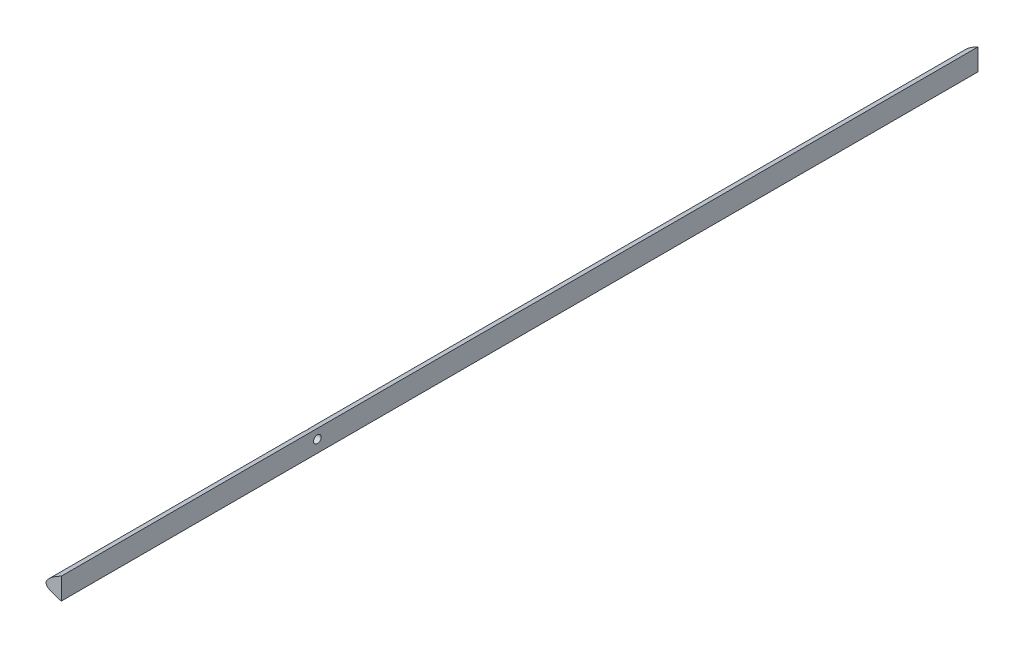
ISO-10303-21;
HEADER;
FILE_DESCRIPTION(('STEP AP214'),'2;1');
FILE_NAME('part.step','',(''),(''),'','','');
FILE_SCHEMA(('AUTOMOTIVE_DESIGN { 1 0 10303 214 1 1 1 1 }'));
ENDSEC;
DATA;
#1=APPLICATION_CONTEXT('core data for automotive mechanical design processes');
#2=APPLICATION_PROTOCOL_DEFINITION('international standard','automotive_design',2000,#1);
#3=PRODUCT_CONTEXT('',#1,'mechanical');
#4=PRODUCT('Part','Part','',(#3));
#5=PRODUCT_RELATED_PRODUCT_CATEGORY('part','',(#4));
#6=PRODUCT_DEFINITION_FORMATION('','',#4);
#7=PRODUCT_DEFINITION_CONTEXT('part definition',#1,'design');
#8=PRODUCT_DEFINITION('design','',#6,#7);
#9=PRODUCT_DEFINITION_SHAPE('','',#8);
#10=(LENGTH_UNIT() NAMED_UNIT(*) SI_UNIT(.MILLI.,.METRE.));
#11=(NAMED_UNIT(*) PLANE_ANGLE_UNIT() SI_UNIT($,.RADIAN.));
#12=(NAMED_UNIT(*) SI_UNIT($,.STERADIAN.) SOLID_ANGLE_UNIT());
#13=UNCERTAINTY_MEASURE_WITH_UNIT(LENGTH_MEASURE(1.E-05),#10,'distance_accuracy_value','');
#14=(GEOMETRIC_REPRESENTATION_CONTEXT(3) GLOBAL_UNCERTAINTY_ASSIGNED_CONTEXT((#13)) GLOBAL_UNIT_ASSIGNED_CONTEXT((#10,
#11,#12)) REPRESENTATION_CONTEXT('',''));
#15=CARTESIAN_POINT('',(0.,0.,0.));
#16=DIRECTION('',(0.,0.,1.));
#17=DIRECTION('',(1.,0.,0.));
#18=AXIS2_PLACEMENT_3D('',#15,#16,#17);
#19=CARTESIAN_POINT('',(1.15165455923713,2.60088125935629,-761.999746));
#20=DIRECTION('',(0.,0.,-1.));
#21=DIRECTION('',(-1.,0.,0.));
#22=AXIS2_PLACEMENT_3D('',#19,#20,#21);
#23=PLANE('',#22);
#24=DIRECTION('',(0.,-1.,0.));
#25=VECTOR('',#24,1.);
#26=CARTESIAN_POINT('',(12.7000000000001,0.,-761.999746));
#27=LINE('',#26,#25);
#28=CARTESIAN_POINT('',(12.7000000000001,11.1170877286177,-761.999746));
#29=VERTEX_POINT('',#28);
#30=CARTESIAN_POINT('',(12.7000000000001,-6.87603561469755,-761.999746));
#31=VERTEX_POINT('',#30);
#32=EDGE_CURVE('E71',#29,#31,#27,.T.);
#33=ORIENTED_EDGE('',*,*,#32,.T.);
#34=CARTESIAN_POINT('',(324.9026935512,0.,-761.999746));
#35=CARTESIAN_POINT('',(324.90346319559,0.0233133583806574,-761.999746));
#36=CARTESIAN_POINT('',(322.493960124611,0.266874853266928,-761.999746));
#37=CARTESIAN_POINT('',(320.107118726271,0.728898481684864,-761.999746));
#38=CARTESIAN_POINT('',(314.479929879271,1.69659954466814,-761.999746));
#39=CARTESIAN_POINT('',(307.761979309178,2.96651084650256,-761.999746));
#40=CARTESIAN_POINT('',(299.156213965818,4.44402058990994,-761.999746));
#41=CARTESIAN_POINT('',(289.108994082194,6.05458721176259,-761.999746));
#42=CARTESIAN_POINT('',(277.614504556848,7.85862541822672,-761.999746));
#43=CARTESIAN_POINT('',(264.867967681756,9.82863928319501,-761.999746));
#44=CARTESIAN_POINT('',(251.037893607433,11.9464568649147,-761.999746));
#45=CARTESIAN_POINT('',(236.320520328163,14.1628286822193,-761.999746));
#46=CARTESIAN_POINT('',(220.915494029042,16.4347978422618,-761.999746));
#47=CARTESIAN_POINT('',(205.033677241231,18.7162921045369,-761.999746));
#48=CARTESIAN_POINT('',(188.883341886899,20.9229885970704,-761.999746));
#49=CARTESIAN_POINT('',(172.682407247215,22.9973105242966,-761.999746));
#50=CARTESIAN_POINT('',(156.622614564687,24.8301784866328,-761.999746));
#51=CARTESIAN_POINT('',(140.85040765116,26.2625796247527,-761.999746));
#52=CARTESIAN_POINT('',(125.478771127742,27.2050458448488,-761.999746));
#53=CARTESIAN_POINT('',(110.596641231566,27.6094132257854,-761.999746));
#54=CARTESIAN_POINT('',(96.2853033385808,27.4446531652477,-761.999746));
#55=CARTESIAN_POINT('',(82.6164523566715,26.7221772489685,-761.999746));
#56=CARTESIAN_POINT('',(69.6684349637199,25.4642524848224,-761.999746));
#57=CARTESIAN_POINT('',(57.5288522663284,23.7890753252532,-761.999746));
#58=CARTESIAN_POINT('',(46.3056688527853,21.7557737945352,-761.999746));
#59=CARTESIAN_POINT('',(36.1124988210342,19.421560606896,-761.999746));
#60=CARTESIAN_POINT('',(27.0454876777921,16.8469786053261,-761.999746));
#61=CARTESIAN_POINT('',(19.1969550247217,14.0824194665185,-761.999746));
#62=CARTESIAN_POINT('',(12.6195182535387,11.1953401492948,-761.999746));
#63=CARTESIAN_POINT('',(7.39382924872228,8.27357700541017,-761.999746));
#64=CARTESIAN_POINT('',(3.46645559888262,5.36260960395899,-761.999746));
#65=CARTESIAN_POINT('',(1.0721441800177,2.69745028336921,-761.999746));
#66=CARTESIAN_POINT('',(-0.44301831227786,-0.0163803086251834,-761.999746));
#67=CARTESIAN_POINT('',(1.14212328936869,-2.66038157127671,-761.999746));
#68=CARTESIAN_POINT('',(4.36503605971503,-4.22676457114381,-761.999746));
#69=CARTESIAN_POINT('',(8.97122140423381,-6.02880941856467,-761.999746));
#70=CARTESIAN_POINT('',(15.243598773671,-7.49562746974023,-761.999746));
#71=CARTESIAN_POINT('',(23.0320560801708,-8.81343307785173,-761.999746));
#72=CARTESIAN_POINT('',(32.3248291039904,-9.88501521121111,-761.999746));
#73=CARTESIAN_POINT('',(43.02561085123,-10.7220049250572,-761.999746));
#74=CARTESIAN_POINT('',(55.0370190293927,-11.3213307402037,-761.999746));
#75=CARTESIAN_POINT('',(68.2344021608391,-11.6831205739109,-761.999746));
#76=CARTESIAN_POINT('',(82.4768909373014,-11.8216946355356,-761.999746));
#77=CARTESIAN_POINT('',(97.6058535702517,-11.7312635564645,-761.999746));
#78=CARTESIAN_POINT('',(113.468681032216,-11.4146303668036,-761.999746));
#79=CARTESIAN_POINT('',(129.930020512529,-10.7984705199419,-761.999746));
#80=CARTESIAN_POINT('',(146.859715046732,-9.93880113727659,-761.999746));
#81=CARTESIAN_POINT('',(164.102555427845,-8.95468862894909,-761.999746));
#82=CARTESIAN_POINT('',(181.455347717627,-7.91418790276717,-761.999746));
#83=CARTESIAN_POINT('',(198.694582838916,-6.86098310953203,-761.999746));
#84=CARTESIAN_POINT('',(215.596359860735,-5.83696040869958,-761.999746));
#85=CARTESIAN_POINT('',(231.942646986744,-4.86345762457903,-761.999746));
#86=CARTESIAN_POINT('',(247.517899408465,-3.96716262112094,-761.999746));
#87=CARTESIAN_POINT('',(262.118380872368,-3.15712058268027,-761.999746));
#88=CARTESIAN_POINT('',(275.542852028211,-2.44567542809517,-761.999746));
#89=CARTESIAN_POINT('',(287.622696903447,-1.83567813821833,-761.999746));
#90=CARTESIAN_POINT('',(298.158964312839,-1.30681197821665,-761.999746));
#91=CARTESIAN_POINT('',(307.165416690346,-0.826816663963498,-761.999746));
#92=CARTESIAN_POINT('',(314.173983408068,-0.368946974828929,-761.999746));
#93=CARTESIAN_POINT('',(319.999788969716,-0.117218531002151,-761.999746));
#94=CARTESIAN_POINT('',(322.456899939764,0.0391125120748008,-761.999746));
#95=CARTESIAN_POINT('',(324.901921434116,-0.0233882589368036,-761.999746));
#96=CARTESIAN_POINT('',(324.9026935512,0.,-761.999746));
#97=B_SPLINE_CURVE_WITH_KNOTS('',3,(#34,#35,#36,#37,#38,#39,#40,#41,#42,#43,#44,#45,#46,#47,#48,
#49,#50,#51,#52,#53,#54,#55,#56,#57,#58,#59,#60,#61,#62,#63,#64,#65,#66,#67,#68,#69,#70,#71,#72,
#73,#74,#75,#76,#77,#78,#79,#80,#81,#82,#83,#84,#85,#86,#87,#88,#89,#90,#91,#92,#93,#94,#95,
#96),.UNSPECIFIED.,.T.,.F.,(4,1,1,1,1,1,1,1,1,1,1,1,1,1,1,1,1,1,1,1,1,1,1,1,1,1,1,1,1,1,1,1,1,1,
1,1,1,1,1,1,1,1,1,1,1,1,1,1,1,1,1,1,1,1,1,1,1,1,1,1,4),(0.,0.00174808161666409,
0.00682736461152588,0.0148802194660928,0.0255723245187996,0.0386941569613535,0.0541707804092893,
0.0718340915004338,0.0914345327939838,0.112684613523076,0.135293128889252,0.158943981406575,
0.183314993013972,0.208069947428828,0.232879415911381,0.257398767385958,0.28138363259568,
0.304705763006072,0.32724149700788,0.348896563368039,0.369606939586334,0.389308375744097,
0.407885695760754,0.425177148613117,0.441026789913431,0.455299971521906,0.467903884546168,
0.478751648141021,0.487814349118281,0.495090030563699,0.500616983015744,0.504451368015862,
0.507803776366331,0.513091193317012,0.52054622904494,0.530249123140569,0.542213645081559,
0.556382479077403,0.572655501749116,0.590894528635496,0.610925387189739,0.632535858974259,
0.655496365431996,0.679547083246405,0.704498568619219,0.730211424578536,0.756435524546716,
0.782836661122501,0.809062449565475,0.834775916464845,0.859641281327499,0.883337826525987,
0.905540839068826,0.925965138816007,0.944326312756837,0.960365876879218,0.973929437555459,
0.984907697461011,0.993111340436855,0.998246302191831,1.),.UNSPECIFIED.);
#98=EDGE_CURVE('E11',#29,#31,#97,.T.);
#99=ORIENTED_EDGE('',*,*,#98,.F.);
#100=EDGE_LOOP('',(#33,#99));
#101=FACE_BOUND('',#100,.T.);
#102=ADVANCED_FACE('F41',(#101),#23,.T.);
#103=CARTESIAN_POINT('',(1.15165455923713,2.60088125935629,0.));
#104=DIRECTION('',(0.,0.,-1.));
#105=DIRECTION('',(-1.,0.,0.));
#106=AXIS2_PLACEMENT_3D('',#103,#104,#105);
#107=PLANE('',#106);
#108=CARTESIAN_POINT('',(324.9026935512,0.,0.));
#109=CARTESIAN_POINT('',(324.90346319559,0.0233133583806574,0.));
#110=CARTESIAN_POINT('',(322.493960124611,0.266874853266928,0.));
#111=CARTESIAN_POINT('',(320.107118726271,0.728898481684864,0.));
#112=CARTESIAN_POINT('',(314.479929879271,1.69659954466814,0.));
#113=CARTESIAN_POINT('',(307.761979309178,2.96651084650256,0.));
#114=CARTESIAN_POINT('',(299.156213965818,4.44402058990994,0.));
#115=CARTESIAN_POINT('',(289.108994082194,6.05458721176259,0.));
#116=CARTESIAN_POINT('',(277.614504556848,7.85862541822672,0.));
#117=CARTESIAN_POINT('',(264.867967681756,9.82863928319501,0.));
#118=CARTESIAN_POINT('',(251.037893607433,11.9464568649147,0.));
#119=CARTESIAN_POINT('',(236.320520328163,14.1628286822193,0.));
#120=CARTESIAN_POINT('',(220.915494029042,16.4347978422618,0.));
#121=CARTESIAN_POINT('',(205.033677241231,18.7162921045369,0.));
#122=CARTESIAN_POINT('',(188.883341886899,20.9229885970704,0.));
#123=CARTESIAN_POINT('',(172.682407247215,22.9973105242966,0.));
#124=CARTESIAN_POINT('',(156.622614564687,24.8301784866328,0.));
#125=CARTESIAN_POINT('',(140.85040765116,26.2625796247527,0.));
#126=CARTESIAN_POINT('',(125.478771127742,27.2050458448488,0.));
#127=CARTESIAN_POINT('',(110.596641231566,27.6094132257854,0.));
#128=CARTESIAN_POINT('',(96.2853033385808,27.4446531652477,0.));
#129=CARTESIAN_POINT('',(82.6164523566715,26.7221772489685,0.));
#130=CARTESIAN_POINT('',(69.6684349637199,25.4642524848224,0.));
#131=CARTESIAN_POINT('',(57.5288522663284,23.7890753252532,0.));
#132=CARTESIAN_POINT('',(46.3056688527853,21.7557737945352,0.));
#133=CARTESIAN_POINT('',(36.1124988210342,19.421560606896,0.));
#134=CARTESIAN_POINT('',(27.0454876777921,16.8469786053261,0.));
#135=CARTESIAN_POINT('',(19.1969550247217,14.0824194665185,0.));
#136=CARTESIAN_POINT('',(12.6195182535387,11.1953401492948,0.));
#137=CARTESIAN_POINT('',(7.39382924872228,8.27357700541017,0.));
#138=CARTESIAN_POINT('',(3.46645559888262,5.36260960395899,0.));
#139=CARTESIAN_POINT('',(1.0721441800177,2.69745028336921,0.));
#140=CARTESIAN_POINT('',(-0.44301831227786,-0.0163803086251834,0.));
#141=CARTESIAN_POINT('',(1.14212328936869,-2.66038157127671,0.));
#142=CARTESIAN_POINT('',(4.36503605971503,-4.22676457114381,0.));
#143=CARTESIAN_POINT('',(8.97122140423381,-6.02880941856467,0.));
#144=CARTESIAN_POINT('',(15.243598773671,-7.49562746974023,0.));
#145=CARTESIAN_POINT('',(23.0320560801708,-8.81343307785173,0.));
#146=CARTESIAN_POINT('',(32.3248291039904,-9.88501521121111,0.));
#147=CARTESIAN_POINT('',(43.02561085123,-10.7220049250572,0.));
#148=CARTESIAN_POINT('',(55.0370190293927,-11.3213307402037,0.));
#149=CARTESIAN_POINT('',(68.2344021608391,-11.6831205739109,0.));
#150=CARTESIAN_POINT('',(82.4768909373014,-11.8216946355356,0.));
#151=CARTESIAN_POINT('',(97.6058535702517,-11.7312635564645,0.));
#152=CARTESIAN_POINT('',(113.468681032216,-11.4146303668036,0.));
#153=CARTESIAN_POINT('',(129.930020512529,-10.7984705199419,0.));
#154=CARTESIAN_POINT('',(146.859715046732,-9.93880113727659,0.));
#155=CARTESIAN_POINT('',(164.102555427845,-8.95468862894909,0.));
#156=CARTESIAN_POINT('',(181.455347717627,-7.91418790276717,0.));
#157=CARTESIAN_POINT('',(198.694582838916,-6.86098310953203,0.));
#158=CARTESIAN_POINT('',(215.596359860735,-5.83696040869958,0.));
#159=CARTESIAN_POINT('',(231.942646986744,-4.86345762457903,0.));
#160=CARTESIAN_POINT('',(247.517899408465,-3.96716262112094,0.));
#161=CARTESIAN_POINT('',(262.118380872368,-3.15712058268027,0.));
#162=CARTESIAN_POINT('',(275.542852028211,-2.44567542809517,0.));
#163=CARTESIAN_POINT('',(287.622696903447,-1.83567813821833,0.));
#164=CARTESIAN_POINT('',(298.158964312839,-1.30681197821665,0.));
#165=CARTESIAN_POINT('',(307.165416690346,-0.826816663963498,0.));
#166=CARTESIAN_POINT('',(314.173983408068,-0.368946974828929,0.));
#167=CARTESIAN_POINT('',(319.999788969716,-0.117218531002151,0.));
#168=CARTESIAN_POINT('',(322.456899939764,0.0391125120748008,0.));
#169=CARTESIAN_POINT('',(324.901921434116,-0.0233882589368036,0.));
#170=CARTESIAN_POINT('',(324.9026935512,0.,0.));
#171=B_SPLINE_CURVE_WITH_KNOTS('',3,(#108,#109,#110,#111,#112,#113,#114,#115,#116,#117,#118,
#119,#120,#121,#122,#123,#124,#125,#126,#127,#128,#129,#130,#131,#132,#133,#134,#135,#136,#137,
#138,#139,#140,#141,#142,#143,#144,#145,#146,#147,#148,#149,#150,#151,#152,#153,#154,#155,#156,
#157,#158,#159,#160,#161,#162,#163,#164,#165,#166,#167,#168,#169,#170),.UNSPECIFIED.,.T.,.F.,(4,
1,1,1,1,1,1,1,1,1,1,1,1,1,1,1,1,1,1,1,1,1,1,1,1,1,1,1,1,1,1,1,1,1,1,1,1,1,1,1,1,1,1,1,1,1,1,1,1,
1,1,1,1,1,1,1,1,1,1,1,4),(0.,0.00174808161666409,0.00682736461152588,0.0148802194660928,
0.0255723245187996,0.0386941569613535,0.0541707804092893,0.0718340915004338,0.0914345327939838,
0.112684613523076,0.135293128889252,0.158943981406575,0.183314993013972,0.208069947428828,
0.232879415911381,0.257398767385958,0.28138363259568,0.304705763006072,0.32724149700788,
0.348896563368039,0.369606939586334,0.389308375744097,0.407885695760754,0.425177148613117,
0.441026789913431,0.455299971521906,0.467903884546168,0.478751648141021,0.487814349118281,
0.495090030563699,0.500616983015744,0.504451368015862,0.507803776366331,0.513091193317012,
0.52054622904494,0.530249123140569,0.542213645081559,0.556382479077403,0.572655501749116,
0.590894528635496,0.610925387189739,0.632535858974259,0.655496365431996,0.679547083246405,
0.704498568619219,0.730211424578536,0.756435524546716,0.782836661122501,0.809062449565475,
0.834775916464845,0.859641281327499,0.883337826525987,0.905540839068826,0.925965138816007,
0.944326312756837,0.960365876879218,0.973929437555459,0.984907697461011,0.993111340436855,
0.998246302191831,1.),.UNSPECIFIED.);
#172=CARTESIAN_POINT('',(12.7000000000001,11.1170877286177,0.));
#173=VERTEX_POINT('',#172);
#174=CARTESIAN_POINT('',(12.7000000000001,-6.87603561469755,0.));
#175=VERTEX_POINT('',#174);
#176=EDGE_CURVE('E52',#173,#175,#171,.T.);
#177=ORIENTED_EDGE('',*,*,#176,.T.);
#178=DIRECTION('',(0.,-1.,0.));
#179=VECTOR('',#178,1.);
#180=CARTESIAN_POINT('',(12.7000000000001,0.,0.));
#181=LINE('',#180,#179);
#182=EDGE_CURVE('E59',#173,#175,#181,.T.);
#183=ORIENTED_EDGE('',*,*,#182,.F.);
#184=EDGE_LOOP('',(#177,#183));
#185=FACE_BOUND('',#184,.T.);
#186=ADVANCED_FACE('F79',(#185),#107,.F.);
#187=CARTESIAN_POINT('',(324.9026935512,0.,-1090.34141295382));
#188=CARTESIAN_POINT('',(324.90346319559,0.0233133583806574,-1090.34141295382));
#189=CARTESIAN_POINT('',(322.493960124611,0.266874853266928,-1090.34141295382));
#190=CARTESIAN_POINT('',(320.107118726271,0.728898481684864,-1090.34141295382));
#191=CARTESIAN_POINT('',(314.479929879271,1.69659954466814,-1090.34141295382));
#192=CARTESIAN_POINT('',(307.761979309178,2.96651084650256,-1090.34141295382));
#193=CARTESIAN_POINT('',(299.156213965818,4.44402058990994,-1090.34141295382));
#194=CARTESIAN_POINT('',(289.108994082194,6.05458721176259,-1090.34141295382));
#195=CARTESIAN_POINT('',(277.614504556848,7.85862541822672,-1090.34141295382));
#196=CARTESIAN_POINT('',(264.867967681756,9.82863928319501,-1090.34141295382));
#197=CARTESIAN_POINT('',(251.037893607433,11.9464568649147,-1090.34141295382));
#198=CARTESIAN_POINT('',(236.320520328163,14.1628286822193,-1090.34141295382));
#199=CARTESIAN_POINT('',(220.915494029042,16.4347978422618,-1090.34141295382));
#200=CARTESIAN_POINT('',(205.033677241231,18.7162921045369,-1090.34141295382));
#201=CARTESIAN_POINT('',(188.883341886899,20.9229885970704,-1090.34141295382));
#202=CARTESIAN_POINT('',(172.682407247215,22.9973105242966,-1090.34141295382));
#203=CARTESIAN_POINT('',(156.622614564687,24.8301784866328,-1090.34141295382));
#204=CARTESIAN_POINT('',(140.85040765116,26.2625796247527,-1090.34141295382));
#205=CARTESIAN_POINT('',(125.478771127742,27.2050458448488,-1090.34141295382));
#206=CARTESIAN_POINT('',(110.596641231566,27.6094132257854,-1090.34141295382));
#207=CARTESIAN_POINT('',(96.2853033385808,27.4446531652477,-1090.34141295382));
#208=CARTESIAN_POINT('',(82.6164523566715,26.7221772489685,-1090.34141295382));
#209=CARTESIAN_POINT('',(69.6684349637199,25.4642524848224,-1090.34141295382));
#210=CARTESIAN_POINT('',(57.5288522663284,23.7890753252532,-1090.34141295382));
#211=CARTESIAN_POINT('',(46.3056688527853,21.7557737945352,-1090.34141295382));
#212=CARTESIAN_POINT('',(36.1124988210342,19.421560606896,-1090.34141295382));
#213=CARTESIAN_POINT('',(27.0454876777921,16.8469786053261,-1090.34141295382));
#214=CARTESIAN_POINT('',(19.1969550247217,14.0824194665185,-1090.34141295382));
#215=CARTESIAN_POINT('',(12.6195182535387,11.1953401492948,-1090.34141295382));
#216=CARTESIAN_POINT('',(7.39382924872228,8.27357700541017,-1090.34141295382));
#217=CARTESIAN_POINT('',(3.46645559888262,5.36260960395899,-1090.34141295382));
#218=CARTESIAN_POINT('',(1.0721441800177,2.69745028336921,-1090.34141295382));
#219=CARTESIAN_POINT('',(-0.44301831227786,-0.0163803086251834,-1090.34141295382));
#220=CARTESIAN_POINT('',(1.14212328936869,-2.66038157127671,-1090.34141295382));
#221=CARTESIAN_POINT('',(4.36503605971503,-4.22676457114381,-1090.34141295382));
#222=CARTESIAN_POINT('',(8.97122140423381,-6.02880941856467,-1090.34141295382));
#223=CARTESIAN_POINT('',(15.243598773671,-7.49562746974023,-1090.34141295382));
#224=CARTESIAN_POINT('',(23.0320560801708,-8.81343307785173,-1090.34141295382));
#225=CARTESIAN_POINT('',(32.3248291039904,-9.88501521121111,-1090.34141295382));
#226=CARTESIAN_POINT('',(43.02561085123,-10.7220049250572,-1090.34141295382));
#227=CARTESIAN_POINT('',(55.0370190293927,-11.3213307402037,-1090.34141295382));
#228=CARTESIAN_POINT('',(68.2344021608391,-11.6831205739109,-1090.34141295382));
#229=CARTESIAN_POINT('',(82.4768909373014,-11.8216946355356,-1090.34141295382));
#230=CARTESIAN_POINT('',(97.6058535702517,-11.7312635564645,-1090.34141295382));
#231=CARTESIAN_POINT('',(113.468681032216,-11.4146303668036,-1090.34141295382));
#232=CARTESIAN_POINT('',(129.930020512529,-10.7984705199419,-1090.34141295382));
#233=CARTESIAN_POINT('',(146.859715046732,-9.93880113727659,-1090.34141295382));
#234=CARTESIAN_POINT('',(164.102555427845,-8.95468862894909,-1090.34141295382));
#235=CARTESIAN_POINT('',(181.455347717627,-7.91418790276717,-1090.34141295382));
#236=CARTESIAN_POINT('',(198.694582838916,-6.86098310953203,-1090.34141295382));
#237=CARTESIAN_POINT('',(215.596359860735,-5.83696040869958,-1090.34141295382));
#238=CARTESIAN_POINT('',(231.942646986744,-4.86345762457903,-1090.34141295382));
#239=CARTESIAN_POINT('',(247.517899408465,-3.96716262112094,-1090.34141295382));
#240=CARTESIAN_POINT('',(262.118380872368,-3.15712058268027,-1090.34141295382));
#241=CARTESIAN_POINT('',(275.542852028211,-2.44567542809517,-1090.34141295382));
#242=CARTESIAN_POINT('',(287.622696903447,-1.83567813821833,-1090.34141295382));
#243=CARTESIAN_POINT('',(298.158964312839,-1.30681197821665,-1090.34141295382));
#244=CARTESIAN_POINT('',(307.165416690346,-0.826816663963498,-1090.34141295382));
#245=CARTESIAN_POINT('',(314.173983408068,-0.368946974828929,-1090.34141295382));
#246=CARTESIAN_POINT('',(319.999788969716,-0.117218531002151,-1090.34141295382));
#247=CARTESIAN_POINT('',(322.456899939764,0.0391125120748008,-1090.34141295382));
#248=CARTESIAN_POINT('',(324.901921434116,-0.0233882589368036,-1090.34141295382));
#249=CARTESIAN_POINT('',(324.9026935512,0.,-1090.34141295382));
#250=B_SPLINE_CURVE_WITH_KNOTS('',3,(#187,#188,#189,#190,#191,#192,#193,#194,#195,#196,#197,
#198,#199,#200,#201,#202,#203,#204,#205,#206,#207,#208,#209,#210,#211,#212,#213,#214,#215,#216,
#217,#218,#219,#220,#221,#222,#223,#224,#225,#226,#227,#228,#229,#230,#231,#232,#233,#234,#235,
#236,#237,#238,#239,#240,#241,#242,#243,#244,#245,#246,#247,#248,#249),.UNSPECIFIED.,.T.,.F.,(4,
1,1,1,1,1,1,1,1,1,1,1,1,1,1,1,1,1,1,1,1,1,1,1,1,1,1,1,1,1,1,1,1,1,1,1,1,1,1,1,1,1,1,1,1,1,1,1,1,
1,1,1,1,1,1,1,1,1,1,1,4),(0.,0.00174808161666409,0.00682736461152588,0.0148802194660928,
0.0255723245187996,0.0386941569613535,0.0541707804092893,0.0718340915004338,0.0914345327939838,
0.112684613523076,0.135293128889252,0.158943981406575,0.183314993013972,0.208069947428828,
0.232879415911381,0.257398767385958,0.28138363259568,0.304705763006072,0.32724149700788,
0.348896563368039,0.369606939586334,0.389308375744097,0.407885695760754,0.425177148613117,
0.441026789913431,0.455299971521906,0.467903884546168,0.478751648141021,0.487814349118281,
0.495090030563699,0.500616983015744,0.504451368015862,0.507803776366331,0.513091193317012,
0.52054622904494,0.530249123140569,0.542213645081559,0.556382479077403,0.572655501749116,
0.590894528635496,0.610925387189739,0.632535858974259,0.655496365431996,0.679547083246405,
0.704498568619219,0.730211424578536,0.756435524546716,0.782836661122501,0.809062449565475,
0.834775916464845,0.859641281327499,0.883337826525987,0.905540839068826,0.925965138816007,
0.944326312756837,0.960365876879218,0.973929437555459,0.984907697461011,0.993111340436855,
0.998246302191831,1.),.UNSPECIFIED.);
#251=DIRECTION('',(0.,0.,1.));
#252=VECTOR('',#251,1.);
#253=SURFACE_OF_LINEAR_EXTRUSION('',#250,#252);
#254=CARTESIAN_POINT('',(0.00110937483010953,0.0680877286177464,-212.852));
#255=CARTESIAN_POINT('',(0.00111134321590343,0.0680866631445692,-212.764657720507));
#256=CARTESIAN_POINT('',(0.00121769431698367,0.0716929967182927,-212.677327986145));
#257=CARTESIAN_POINT('',(0.00175696645581528,0.0860930091859319,-212.503234384987));
#258=CARTESIAN_POINT('',(0.00218997213027666,0.0968885507298511,-212.416470670727));
#259=CARTESIAN_POINT('',(0.00370040152180444,0.125613421238487,-212.244028258938));
#260=CARTESIAN_POINT('',(0.00477862216750329,0.143551563107165,-212.15835103724));
#261=CARTESIAN_POINT('',(0.00808794131820573,0.186443270247462,-211.988748154365));
#262=CARTESIAN_POINT('',(0.0103195777922176,0.211400106656466,-211.904823329549));
#263=CARTESIAN_POINT('',(0.0165972784486609,0.26821140974571,-211.739154904456));
#264=CARTESIAN_POINT('',(0.0206481853739382,0.300084168209147,-211.657417746956));
#265=CARTESIAN_POINT('',(0.0313116576172859,0.370395052725221,-211.497037726922));
#266=CARTESIAN_POINT('',(0.0379227981172002,0.408829520422683,-211.418393170065));
#267=CARTESIAN_POINT('',(0.054462002419068,0.491846205448004,-211.264896191096));
#268=CARTESIAN_POINT('',(0.0643861285127068,0.536421087708146,-211.190039388044));
#269=CARTESIAN_POINT('',(0.0882472375428461,0.631239362194061,-211.044681419204));
#270=CARTESIAN_POINT('',(0.102183802109909,0.681482163104585,-210.97417980024));
#271=CARTESIAN_POINT('',(0.133620682132948,0.783782807881961,-210.842277924139));
#272=CARTESIAN_POINT('',(0.15085356373093,0.835545713303802,-210.780585001244));
#273=CARTESIAN_POINT('',(0.18959183650345,0.942861072514161,-210.662028588604));
#274=CARTESIAN_POINT('',(0.21109701922534,0.99841334132656,-210.605164863427));
#275=CARTESIAN_POINT('',(0.258437034248168,1.11262105106069,-210.496592133124));
#276=CARTESIAN_POINT('',(0.28427202678329,1.17127660677142,-210.444883318879));
#277=CARTESIAN_POINT('',(0.340129871406615,1.2910041193435,-210.34680854813));
#278=CARTESIAN_POINT('',(0.37015283365928,1.35207613973963,-210.300442732232));
#279=CARTESIAN_POINT('',(0.432315450725431,1.4725859334904,-210.215509757899));
#280=CARTESIAN_POINT('',(0.464247275458675,1.53192829133687,-210.176653635589));
#281=CARTESIAN_POINT('',(0.531227187545306,1.65176313299576,-210.103685311835));
#282=CARTESIAN_POINT('',(0.566275692271024,1.71225576999328,-210.069573747335));
#283=CARTESIAN_POINT('',(0.639105177253106,1.83407116335767,-210.00594593727));
#284=CARTESIAN_POINT('',(0.676888227240416,1.8953945193361,-209.976433226911));
#285=CARTESIAN_POINT('',(0.754742991363791,2.01857871924413,-209.921856157657));
#286=CARTESIAN_POINT('',(0.794815202237528,2.08043967734288,-209.896792769129));
#287=CARTESIAN_POINT('',(0.867850648396618,2.19099932213155,-209.855934218761));
#288=CARTESIAN_POINT('',(0.90045999120677,2.23962849335798,-209.839309577158));
#289=CARTESIAN_POINT('',(0.96661631675626,2.33704958585804,-209.808592688735));
#290=CARTESIAN_POINT('',(1.00016336650838,2.38584151854277,-209.79450062344));
#291=CARTESIAN_POINT('',(1.10216374335772,2.5322802342161,-209.755943147017));
#292=CARTESIAN_POINT('',(1.17197360947317,2.62998586461519,-209.73519794301));
#293=CARTESIAN_POINT('',(1.31477756627206,2.82473426422432,-209.7031337027));
#294=CARTESIAN_POINT('',(1.38777494489292,2.92177622356928,-209.69182465368));
#295=CARTESIAN_POINT('',(1.53643819112492,3.11441697032521,-209.678139037104));
#296=CARTESIAN_POINT('',(1.61210405387339,3.21001576036555,-209.675762453273));
#297=CARTESIAN_POINT('',(1.78522435090116,3.42335749190037,-209.679897980687));
#298=CARTESIAN_POINT('',(1.88331867913634,3.54053718749294,-209.68882885078));
#299=CARTESIAN_POINT('',(2.08211700736507,3.77104127547881,-209.719044571543));
#300=CARTESIAN_POINT('',(2.18282175352997,3.88436454364259,-209.740332992587));
#301=CARTESIAN_POINT('',(2.38612423025804,4.10684504391337,-209.794601249384));
#302=CARTESIAN_POINT('',(2.48872541573428,4.21599326720459,-209.827604943528));
#303=CARTESIAN_POINT('',(2.69466036952816,4.42949893194086,-209.904808063944));
#304=CARTESIAN_POINT('',(2.79799405656226,4.53385689562913,-209.949006266329));
#305=CARTESIAN_POINT('',(3.00569918090079,4.73878237295193,-210.049021285545));
#306=CARTESIAN_POINT('',(3.11006716275596,4.83928504522573,-210.104978319349));
#307=CARTESIAN_POINT('',(3.31733918663545,5.03475551076143,-210.228279639372));
#308=CARTESIAN_POINT('',(3.42024278869969,5.1297216660992,-210.295627272632));
#309=CARTESIAN_POINT('',(3.62287804770344,5.31325245857488,-210.44186042947));
#310=CARTESIAN_POINT('',(3.72261807134271,5.40183493753717,-210.520711771602));
#311=CARTESIAN_POINT('',(3.9174244454592,5.57196999674445,-210.69066297191));
#312=CARTESIAN_POINT('',(4.01249473359183,5.65352854506406,-210.781752259871));
#313=CARTESIAN_POINT('',(4.20080071145396,5.8127185292905,-210.982522376276));
#314=CARTESIAN_POINT('',(4.29364205821661,5.88988112244307,-211.092954239968));
#315=CARTESIAN_POINT('',(4.46762751574914,6.03263565485399,-211.32947705717));
#316=CARTESIAN_POINT('',(4.54878614215454,6.09824197572002,-211.455548209844));
#317=CARTESIAN_POINT('',(4.67997085032671,6.20325882892551,-211.697905972985));
#318=CARTESIAN_POINT('',(4.73298254013217,6.24528062709038,-211.811416477996));
#319=CARTESIAN_POINT('',(4.82405401696539,6.31706638965844,-212.047959071486));
#320=CARTESIAN_POINT('',(4.86213524868375,6.3468479377862,-212.17097719762));
#321=CARTESIAN_POINT('',(4.91533779211872,6.38833454987421,-212.404844945242));
#322=CARTESIAN_POINT('',(4.93305523450692,6.40208811097345,-212.514732574008));
#323=CARTESIAN_POINT('',(4.95348477806004,6.41794071973939,-212.736717463743));
#324=CARTESIAN_POINT('',(4.95620538638547,6.42004637484345,-212.848813435771));
#325=CARTESIAN_POINT('',(4.94638399302921,6.41243105041143,-213.071869116082));
#326=CARTESIAN_POINT('',(4.93384709014909,6.40271402181608,-213.182829191469));
#327=CARTESIAN_POINT('',(4.89470586394997,6.3722591917598,-213.400672273302));
#328=CARTESIAN_POINT('',(4.86809051737399,6.35151275433627,-213.507552014486));
#329=CARTESIAN_POINT('',(4.79298451105247,6.29263596235171,-213.746580938139));
#330=CARTESIAN_POINT('',(4.74030900313101,6.25114285941334,-213.876573162236));
#331=CARTESIAN_POINT('',(4.619698085082,6.1551520682864,-214.124095247951));
#332=CARTESIAN_POINT('',(4.55173198389046,6.10062821104252,-214.241599335259));
#333=CARTESIAN_POINT('',(4.42409038519924,5.99695730355692,-214.434883847459));
#334=CARTESIAN_POINT('',(4.36685515399236,5.95009921293254,-214.513568206252));
#335=CARTESIAN_POINT('',(4.24777567709381,5.85163306810449,-214.664241756276));
#336=CARTESIAN_POINT('',(4.18592925767932,5.80002277097341,-214.73622775348));
#337=CARTESIAN_POINT('',(4.05864246315642,5.69263385775879,-214.873875970753));
#338=CARTESIAN_POINT('',(3.99319603887693,5.63684816520164,-214.939527002707));
#339=CARTESIAN_POINT('',(3.85967316752171,5.52167573503357,-215.064666019428));
#340=CARTESIAN_POINT('',(3.79159680414182,5.46228911198538,-215.124154200103));
#341=CARTESIAN_POINT('',(3.62337096882282,5.31364653891227,-215.261915785516));
#342=CARTESIAN_POINT('',(3.52218301911917,5.2226602179311,-215.337065805096));
#343=CARTESIAN_POINT('',(3.31738346485244,5.03474429050307,-215.475782543107));
#344=CARTESIAN_POINT('',(3.21377086356165,4.93781221234947,-215.539344400016));
#345=CARTESIAN_POINT('',(3.00537899105179,4.7384127631536,-215.655200570907));
#346=CARTESIAN_POINT('',(2.90059876020679,4.63594052412366,-215.707484767469));
#347=CARTESIAN_POINT('',(2.69114431981251,4.42588736204122,-215.80069601607));
#348=CARTESIAN_POINT('',(2.58647009648847,4.31830722345462,-215.841624805496));
#349=CARTESIAN_POINT('',(2.37668138672063,4.09670676766471,-215.912340883892));
#350=CARTESIAN_POINT('',(2.27158369446458,3.98261423680043,-215.941952546335));
#351=CARTESIAN_POINT('',(2.06353439732685,3.74991506507257,-215.988531380687));
#352=CARTESIAN_POINT('',(1.96058315432873,3.63130767239383,-216.005496436915));
#353=CARTESIAN_POINT('',(1.7580182137496,3.39047903708631,-216.025874315064));
#354=CARTESIAN_POINT('',(1.65839889638972,3.26826460988776,-216.029311229547));
#355=CARTESIAN_POINT('',(1.46332752547299,3.02103578131971,-216.021636086298));
#356=CARTESIAN_POINT('',(1.36787313173093,2.89602301362086,-216.010532310357));
#357=CARTESIAN_POINT('',(1.21387788019435,2.68760012782061,-215.979148707352));
#358=CARTESIAN_POINT('',(1.15387646527808,2.60458257318672,-215.963305326155));
#359=CARTESIAN_POINT('',(1.03637715209174,2.43843749506164,-215.924528640469));
#360=CARTESIAN_POINT('',(0.97887875404059,2.35530999697028,-215.901596758828));
#361=CARTESIAN_POINT('',(0.866671597889827,2.18962055958083,-215.848399289749));
#362=CARTESIAN_POINT('',(0.811960467295762,2.10705819288409,-215.818140069915));
#363=CARTESIAN_POINT('',(0.70628206840646,1.94274126872446,-215.749866411396));
#364=CARTESIAN_POINT('',(0.655313754322733,1.86098649117945,-215.711854150304));
#365=CARTESIAN_POINT('',(0.568222684713003,1.71565322710396,-215.636387202478));
#366=CARTESIAN_POINT('',(0.531212124370738,1.65181857470002,-215.600448998699));
#367=CARTESIAN_POINT('',(0.460669660228857,1.52544090568727,-215.523290391726));
#368=CARTESIAN_POINT('',(0.427136855282542,1.46289755786016,-215.482071363105));
#369=CARTESIAN_POINT('',(0.363994998931474,1.3397071707573,-215.394336847919));
#370=CARTESIAN_POINT('',(0.334380695188355,1.27905767806737,-215.347828609811));
#371=CARTESIAN_POINT('',(0.27931446200474,1.16019328198534,-215.249524240176));
#372=CARTESIAN_POINT('',(0.253862523439762,1.10197837325649,-215.197728120242));
#373=CARTESIAN_POINT('',(0.20715171659807,0.98842246732669,-215.088811090576));
#374=CARTESIAN_POINT('',(0.185911093860658,0.933094709221744,-215.031668524539));
#375=CARTESIAN_POINT('',(0.147689867547827,0.826266741649233,-214.912582570557));
#376=CARTESIAN_POINT('',(0.130709344944527,0.774766604946714,-214.850639091391));
#377=CARTESIAN_POINT('',(0.100719440124079,0.676169421711519,-214.722322510654));
#378=CARTESIAN_POINT('',(0.087714511458882,0.629077353856961,-214.65594454212));
#379=CARTESIAN_POINT('',(0.0652517750538519,0.539905449308003,-214.519361016207));
#380=CARTESIAN_POINT('',(0.0557939253620398,0.497825553337707,-214.449155504108));
#381=CARTESIAN_POINT('',(0.0327551311312588,0.384035403850833,-214.241386658996));
#382=CARTESIAN_POINT('',(0.0229993338580578,0.319296797189554,-214.099498878284));
#383=CARTESIAN_POINT('',(0.00984211065518324,0.211348306189516,-213.807716535234));
#384=CARTESIAN_POINT('',(0.00643512266849266,0.168119601845569,-213.657829099774));
#385=CARTESIAN_POINT('',(0.00295298374153126,0.113504959238416,-213.39825495683));
#386=CARTESIAN_POINT('',(0.00219219624359526,0.0964910469640994,-213.28972526338));
#387=CARTESIAN_POINT('',(0.00126914731997225,0.0737829470611602,-213.071457136317));
#388=CARTESIAN_POINT('',(0.00110690215968597,0.0680890670565934,-212.961718669936));
#389=CARTESIAN_POINT('',(0.00110937483010953,0.0680877286177464,-212.852));
#390=B_SPLINE_CURVE_WITH_KNOTS('',3,(#254,#255,#256,#257,#258,#259,#260,#261,#262,#263,#264,
#265,#266,#267,#268,#269,#270,#271,#272,#273,#274,#275,#276,#277,#278,#279,#280,#281,#282,#283,
#284,#285,#286,#287,#288,#289,#290,#291,#292,#293,#294,#295,#296,#297,#298,#299,#300,#301,#302,
#303,#304,#305,#306,#307,#308,#309,#310,#311,#312,#313,#314,#315,#316,#317,#318,#319,#320,#321,
#322,#323,#324,#325,#326,#327,#328,#329,#330,#331,#332,#333,#334,#335,#336,#337,#338,#339,#340,
#341,#342,#343,#344,#345,#346,#347,#348,#349,#350,#351,#352,#353,#354,#355,#356,#357,#358,#359,
#360,#361,#362,#363,#364,#365,#366,#367,#368,#369,#370,#371,#372,#373,#374,#375,#376,#377,#378,
#379,#380,#381,#382,#383,#384,#385,#386,#387,#388,#389),.UNSPECIFIED.,.T.,.F.,(4,2,2,2,2,2,2,2,
2,2,2,2,2,2,2,2,2,2,2,2,2,2,2,2,2,2,2,2,2,2,2,2,2,2,2,2,2,2,2,2,2,2,2,2,2,2,2,2,2,2,2,2,2,2,2,2,
2,2,2,2,2,2,2,2,2,2,2,4),(0.,0.261930736098554,0.523929362179215,0.786252262225769,
1.04869762384139,1.31184577191564,1.57484768306173,1.83753810498582,2.10020114658552,
2.34693228529961,2.59365138854798,2.84037962419904,3.08711435125581,3.32025170706989,
3.55342033078475,3.78676731965565,4.02016513755249,4.20269896149524,4.38524586365146,
4.7503549143597,5.1158499102293,5.48134424010593,5.93995292892454,6.39869418603937,
6.85837509006474,7.31800575919198,7.78346451165704,8.24906027396559,8.71329975233724,
9.17714080302998,9.66671314105822,10.1556718416558,10.5506587460319,10.9450762320287,
11.2800235930016,11.6147809309066,11.9494264292967,12.2843343399081,12.7207284777172,
13.1580064808437,13.4815709524866,13.8052889293278,14.1295685405344,14.4538378402712,
14.919540261283,15.3854376087085,15.8517511996559,16.3179934048453,16.7912026659425,
17.2644910735851,17.7369362092057,18.209112376124,18.5198185308906,18.8304623592399,
19.1408371945703,19.4511249747912,19.6971195739415,19.9430502715312,20.1886479114384,
20.4342450129542,20.6808839673766,20.9275276093334,21.1744465431714,21.4213625565599,
21.8880947815392,22.354417919741,22.6834442652791,23.0124795520494),.UNSPECIFIED.);
#391=CARTESIAN_POINT('',(0.00110937483010953,0.0680877286177464,-212.852));
#392=VERTEX_POINT('',#391);
#393=EDGE_CURVE('E81',#392,#392,#390,.T.);
#394=ORIENTED_EDGE('',*,*,#393,.F.);
#395=EDGE_LOOP('',(#394));
#396=FACE_BOUND('',#395,.T.);
#397=DIRECTION('',(0.,0.,1.));
#398=VECTOR('',#397,1.);
#399=CARTESIAN_POINT('',(12.7000000000001,11.1170877286177,-761.999746));
#400=LINE('',#399,#398);
#401=EDGE_CURVE('E69',#29,#173,#400,.T.);
#402=ORIENTED_EDGE('',*,*,#401,.F.);
#403=ORIENTED_EDGE('',*,*,#98,.T.);
#404=DIRECTION('',(0.,0.,1.));
#405=VECTOR('',#404,1.);
#406=CARTESIAN_POINT('',(12.7000000000001,-6.87603561469755,-761.999746));
#407=LINE('',#406,#405);
#408=EDGE_CURVE('E64',#31,#175,#407,.T.);
#409=ORIENTED_EDGE('',*,*,#408,.T.);
#410=ORIENTED_EDGE('',*,*,#176,.F.);
#411=EDGE_LOOP('',(#402,#403,#409,#410));
#412=FACE_BOUND('',#411,.T.);
#413=ADVANCED_FACE('F83',(#396,#412),#253,.T.);
#414=CARTESIAN_POINT('',(12.7000000000001,0.,-761.999746));
#415=DIRECTION('',(-1.,0.,0.));
#416=DIRECTION('',(0.,-1.,0.));
#417=AXIS2_PLACEMENT_3D('',#414,#415,#416);
#418=PLANE('',#417);
#419=CARTESIAN_POINT('',(12.7000000000003,3.24308772861773,-212.852));
#420=DIRECTION('',(-1.,0.,0.));
#421=DIRECTION('',(0.,-1.,0.));
#422=AXIS2_PLACEMENT_3D('',#419,#420,#421);
#423=CIRCLE('',#422,3.175);
#424=CARTESIAN_POINT('',(12.7000000000003,0.0680877286177322,-212.852));
#425=VERTEX_POINT('',#424);
#426=EDGE_CURVE('E108',#425,#425,#423,.T.);
#427=ORIENTED_EDGE('',*,*,#426,.T.);
#428=EDGE_LOOP('',(#427));
#429=FACE_BOUND('',#428,.T.);
#430=ORIENTED_EDGE('',*,*,#182,.T.);
#431=ORIENTED_EDGE('',*,*,#408,.F.);
#432=ORIENTED_EDGE('',*,*,#32,.F.);
#433=ORIENTED_EDGE('',*,*,#401,.T.);
#434=EDGE_LOOP('',(#430,#431,#432,#433));
#435=FACE_BOUND('',#434,.T.);
#436=ADVANCED_FACE('F70',(#429,#435),#418,.F.);
#437=CARTESIAN_POINT('',(12.7000000000003,3.24308772861773,-212.852));
#438=DIRECTION('',(-1.,0.,0.));
#439=DIRECTION('',(0.,-1.,0.));
#440=AXIS2_PLACEMENT_3D('',#437,#438,#439);
#441=CYLINDRICAL_SURFACE('',#440,3.175);
#442=ORIENTED_EDGE('',*,*,#393,.T.);
#443=EDGE_LOOP('',(#442));
#444=FACE_BOUND('',#443,.T.);
#445=ORIENTED_EDGE('',*,*,#426,.F.);
#446=EDGE_LOOP('',(#445));
#447=FACE_BOUND('',#446,.T.);
#448=ADVANCED_FACE('F111',(#444,#447),#441,.F.);
#449=CLOSED_SHELL('',(#102,#186,#413,#436,#448));
#450=MANIFOLD_SOLID_BREP('B2',#449);
#451=ADVANCED_BREP_SHAPE_REPRESENTATION('',(#18,#450),#14);
#452=SHAPE_DEFINITION_REPRESENTATION(#9,#451);
ENDSEC;
END-ISO-10303-21;
